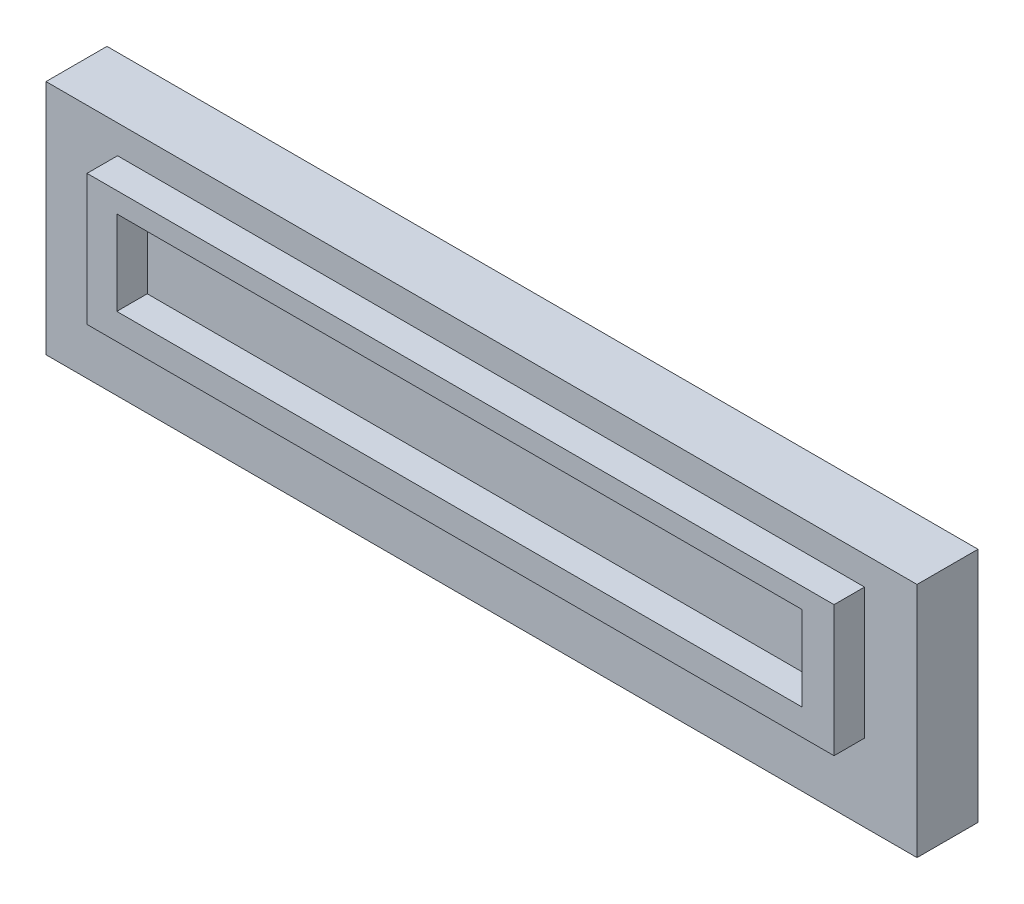
ISO-10303-21;
HEADER;
FILE_DESCRIPTION(('STEP AP214'),'2;1');
FILE_NAME('part.step','',(''),(''),'','','');
FILE_SCHEMA(('AUTOMOTIVE_DESIGN { 1 0 10303 214 1 1 1 1 }'));
ENDSEC;
DATA;
#1=APPLICATION_CONTEXT('core data for automotive mechanical design processes');
#2=APPLICATION_PROTOCOL_DEFINITION('international standard','automotive_design',2000,#1);
#3=PRODUCT_CONTEXT('',#1,'mechanical');
#4=PRODUCT('Part','Part','',(#3));
#5=PRODUCT_RELATED_PRODUCT_CATEGORY('part','',(#4));
#6=PRODUCT_DEFINITION_FORMATION('','',#4);
#7=PRODUCT_DEFINITION_CONTEXT('part definition',#1,'design');
#8=PRODUCT_DEFINITION('design','',#6,#7);
#9=PRODUCT_DEFINITION_SHAPE('','',#8);
#10=(LENGTH_UNIT() NAMED_UNIT(*) SI_UNIT(.MILLI.,.METRE.));
#11=(NAMED_UNIT(*) PLANE_ANGLE_UNIT() SI_UNIT($,.RADIAN.));
#12=(NAMED_UNIT(*) SI_UNIT($,.STERADIAN.) SOLID_ANGLE_UNIT());
#13=UNCERTAINTY_MEASURE_WITH_UNIT(LENGTH_MEASURE(1.E-05),#10,'distance_accuracy_value','');
#14=(GEOMETRIC_REPRESENTATION_CONTEXT(3) GLOBAL_UNCERTAINTY_ASSIGNED_CONTEXT((#13)) GLOBAL_UNIT_ASSIGNED_CONTEXT((#10,
#11,#12)) REPRESENTATION_CONTEXT('',''));
#15=CARTESIAN_POINT('',(0.,0.,0.));
#16=DIRECTION('',(0.,0.,1.));
#17=DIRECTION('',(1.,0.,0.));
#18=AXIS2_PLACEMENT_3D('',#15,#16,#17);
#19=CARTESIAN_POINT('',(0.,0.,10.));
#20=DIRECTION('',(0.,0.,-1.));
#21=DIRECTION('',(-1.,0.,0.));
#22=AXIS2_PLACEMENT_3D('',#19,#20,#21);
#23=PLANE('',#22);
#24=DIRECTION('',(0.,1.,0.));
#25=VECTOR('',#24,1.);
#26=CARTESIAN_POINT('',(57.347833866831,20.432312066326,10.));
#27=LINE('',#26,#25);
#28=CARTESIAN_POINT('',(57.347833866831,-18.3719108495537,10.));
#29=VERTEX_POINT('',#28);
#30=CARTESIAN_POINT('',(57.347833866831,20.432312066326,10.));
#31=VERTEX_POINT('',#30);
#32=EDGE_CURVE('E192',#29,#31,#27,.T.);
#33=ORIENTED_EDGE('',*,*,#32,.T.);
#34=DIRECTION('',(-1.,0.,0.));
#35=VECTOR('',#34,1.);
#36=CARTESIAN_POINT('',(57.347833866831,20.432312066326,10.));
#37=LINE('',#36,#35);
#38=CARTESIAN_POINT('',(-85.5066504960535,20.432312066326,10.));
#39=VERTEX_POINT('',#38);
#40=EDGE_CURVE('E195',#31,#39,#37,.T.);
#41=ORIENTED_EDGE('',*,*,#40,.T.);
#42=DIRECTION('',(0.,-1.,0.));
#43=VECTOR('',#42,1.);
#44=CARTESIAN_POINT('',(-85.5066504960535,20.432312066326,10.));
#45=LINE('',#44,#43);
#46=CARTESIAN_POINT('',(-85.5066504960535,-18.3719108495537,10.));
#47=VERTEX_POINT('',#46);
#48=EDGE_CURVE('E198',#39,#47,#45,.T.);
#49=ORIENTED_EDGE('',*,*,#48,.T.);
#50=DIRECTION('',(1.,0.,0.));
#51=VECTOR('',#50,1.);
#52=CARTESIAN_POINT('',(57.347833866831,-18.3719108495537,10.));
#53=LINE('',#52,#51);
#54=EDGE_CURVE('E200',#47,#29,#53,.T.);
#55=ORIENTED_EDGE('',*,*,#54,.T.);
#56=EDGE_LOOP('',(#33,#41,#49,#55));
#57=FACE_BOUND('',#56,.T.);
#58=DIRECTION('',(0.,1.,0.));
#59=VECTOR('',#58,1.);
#60=CARTESIAN_POINT('',(48.73819832638,15.7591735940845,10.));
#61=LINE('',#60,#59);
#62=CARTESIAN_POINT('',(48.73819832638,-5.7002572460057,10.));
#63=VERTEX_POINT('',#62);
#64=CARTESIAN_POINT('',(48.73819832638,15.7591735940845,10.));
#65=VERTEX_POINT('',#64);
#66=EDGE_CURVE('E140',#63,#65,#61,.T.);
#67=ORIENTED_EDGE('',*,*,#66,.F.);
#68=DIRECTION('',(1.,0.,0.));
#69=VECTOR('',#68,1.);
#70=CARTESIAN_POINT('',(48.73819832638,-5.7002572460057,10.));
#71=LINE('',#70,#69);
#72=CARTESIAN_POINT('',(-73.7756431970439,-5.70025724600572,10.));
#73=VERTEX_POINT('',#72);
#74=EDGE_CURVE('E168',#73,#63,#71,.T.);
#75=ORIENTED_EDGE('',*,*,#74,.F.);
#76=DIRECTION('',(0.,-1.,0.));
#77=VECTOR('',#76,1.);
#78=CARTESIAN_POINT('',(-73.7756431970439,15.7591735940845,10.));
#79=LINE('',#78,#77);
#80=CARTESIAN_POINT('',(-73.7756431970439,15.7591735940845,10.));
#81=VERTEX_POINT('',#80);
#82=EDGE_CURVE('E54',#81,#73,#79,.T.);
#83=ORIENTED_EDGE('',*,*,#82,.F.);
#84=DIRECTION('',(-1.,0.,0.));
#85=VECTOR('',#84,1.);
#86=CARTESIAN_POINT('',(48.73819832638,15.7591735940845,10.));
#87=LINE('',#86,#85);
#88=EDGE_CURVE('E49',#65,#81,#87,.T.);
#89=ORIENTED_EDGE('',*,*,#88,.F.);
#90=EDGE_LOOP('',(#67,#75,#83,#89));
#91=FACE_BOUND('',#90,.T.);
#92=ADVANCED_FACE('F34',(#57,#91),#23,.F.);
#93=CARTESIAN_POINT('',(57.347833866831,20.432312066326,10.));
#94=DIRECTION('',(-1.,0.,0.));
#95=DIRECTION('',(0.,0.,1.));
#96=AXIS2_PLACEMENT_3D('',#93,#94,#95);
#97=PLANE('',#96);
#98=DIRECTION('',(0.,1.,0.));
#99=VECTOR('',#98,1.);
#100=CARTESIAN_POINT('',(57.347833866831,20.432312066326,0.));
#101=LINE('',#100,#99);
#102=CARTESIAN_POINT('',(57.347833866831,-18.3719108495537,0.));
#103=VERTEX_POINT('',#102);
#104=CARTESIAN_POINT('',(57.347833866831,20.432312066326,0.));
#105=VERTEX_POINT('',#104);
#106=EDGE_CURVE('E191',#103,#105,#101,.T.);
#107=ORIENTED_EDGE('',*,*,#106,.T.);
#108=DIRECTION('',(0.,0.,-1.));
#109=VECTOR('',#108,1.);
#110=CARTESIAN_POINT('',(57.347833866831,20.432312066326,10.));
#111=LINE('',#110,#109);
#112=EDGE_CURVE('E11',#31,#105,#111,.T.);
#113=ORIENTED_EDGE('',*,*,#112,.F.);
#114=ORIENTED_EDGE('',*,*,#32,.F.);
#115=DIRECTION('',(0.,0.,-1.));
#116=VECTOR('',#115,1.);
#117=CARTESIAN_POINT('',(57.347833866831,-18.3719108495537,10.));
#118=LINE('',#117,#116);
#119=EDGE_CURVE('E202',#29,#103,#118,.T.);
#120=ORIENTED_EDGE('',*,*,#119,.T.);
#121=EDGE_LOOP('',(#107,#113,#114,#120));
#122=FACE_BOUND('',#121,.T.);
#123=ADVANCED_FACE('F36',(#122),#97,.F.);
#124=CARTESIAN_POINT('',(57.347833866831,20.432312066326,10.));
#125=DIRECTION('',(0.,-1.,0.));
#126=DIRECTION('',(0.,0.,-1.));
#127=AXIS2_PLACEMENT_3D('',#124,#125,#126);
#128=PLANE('',#127);
#129=DIRECTION('',(-1.,0.,0.));
#130=VECTOR('',#129,1.);
#131=CARTESIAN_POINT('',(57.347833866831,20.432312066326,0.));
#132=LINE('',#131,#130);
#133=CARTESIAN_POINT('',(-85.5066504960535,20.432312066326,0.));
#134=VERTEX_POINT('',#133);
#135=EDGE_CURVE('E205',#105,#134,#132,.T.);
#136=ORIENTED_EDGE('',*,*,#135,.T.);
#137=DIRECTION('',(0.,0.,-1.));
#138=VECTOR('',#137,1.);
#139=CARTESIAN_POINT('',(-85.5066504960535,20.432312066326,10.));
#140=LINE('',#139,#138);
#141=EDGE_CURVE('E42',#39,#134,#140,.T.);
#142=ORIENTED_EDGE('',*,*,#141,.F.);
#143=ORIENTED_EDGE('',*,*,#40,.F.);
#144=ORIENTED_EDGE('',*,*,#112,.T.);
#145=EDGE_LOOP('',(#136,#142,#143,#144));
#146=FACE_BOUND('',#145,.T.);
#147=ADVANCED_FACE('F234',(#146),#128,.F.);
#148=CARTESIAN_POINT('',(-85.5066504960535,20.432312066326,10.));
#149=DIRECTION('',(1.,0.,0.));
#150=DIRECTION('',(0.,0.,-1.));
#151=AXIS2_PLACEMENT_3D('',#148,#149,#150);
#152=PLANE('',#151);
#153=DIRECTION('',(0.,-1.,0.));
#154=VECTOR('',#153,1.);
#155=CARTESIAN_POINT('',(-85.5066504960535,20.432312066326,0.));
#156=LINE('',#155,#154);
#157=CARTESIAN_POINT('',(-85.5066504960535,-18.3719108495537,0.));
#158=VERTEX_POINT('',#157);
#159=EDGE_CURVE('E207',#134,#158,#156,.T.);
#160=ORIENTED_EDGE('',*,*,#159,.T.);
#161=DIRECTION('',(0.,0.,-1.));
#162=VECTOR('',#161,1.);
#163=CARTESIAN_POINT('',(-85.5066504960535,-18.3719108495537,10.));
#164=LINE('',#163,#162);
#165=EDGE_CURVE('E212',#47,#158,#164,.T.);
#166=ORIENTED_EDGE('',*,*,#165,.F.);
#167=ORIENTED_EDGE('',*,*,#48,.F.);
#168=ORIENTED_EDGE('',*,*,#141,.T.);
#169=EDGE_LOOP('',(#160,#166,#167,#168));
#170=FACE_BOUND('',#169,.T.);
#171=ADVANCED_FACE('F219',(#170),#152,.F.);
#172=CARTESIAN_POINT('',(57.347833866831,-18.3719108495537,10.));
#173=DIRECTION('',(0.,1.,0.));
#174=DIRECTION('',(0.,0.,1.));
#175=AXIS2_PLACEMENT_3D('',#172,#173,#174);
#176=PLANE('',#175);
#177=DIRECTION('',(1.,0.,0.));
#178=VECTOR('',#177,1.);
#179=CARTESIAN_POINT('',(57.347833866831,-18.3719108495537,0.));
#180=LINE('',#179,#178);
#181=EDGE_CURVE('E196',#158,#103,#180,.T.);
#182=ORIENTED_EDGE('',*,*,#181,.T.);
#183=ORIENTED_EDGE('',*,*,#119,.F.);
#184=ORIENTED_EDGE('',*,*,#54,.F.);
#185=ORIENTED_EDGE('',*,*,#165,.T.);
#186=EDGE_LOOP('',(#182,#183,#184,#185));
#187=FACE_BOUND('',#186,.T.);
#188=ADVANCED_FACE('F228',(#187),#176,.F.);
#189=CARTESIAN_POINT('',(0.,0.,0.));
#190=DIRECTION('',(0.,0.,-1.));
#191=DIRECTION('',(-1.,0.,0.));
#192=AXIS2_PLACEMENT_3D('',#189,#190,#191);
#193=PLANE('',#192);
#194=ORIENTED_EDGE('',*,*,#106,.F.);
#195=ORIENTED_EDGE('',*,*,#181,.F.);
#196=ORIENTED_EDGE('',*,*,#159,.F.);
#197=ORIENTED_EDGE('',*,*,#135,.F.);
#198=EDGE_LOOP('',(#194,#195,#196,#197));
#199=FACE_BOUND('',#198,.T.);
#200=ADVANCED_FACE('F225',(#199),#193,.T.);
#201=CARTESIAN_POINT('',(0.,0.,15.));
#202=DIRECTION('',(0.,0.,-1.));
#203=DIRECTION('',(-1.,0.,0.));
#204=AXIS2_PLACEMENT_3D('',#201,#202,#203);
#205=PLANE('',#204);
#206=DIRECTION('',(0.,1.,0.));
#207=VECTOR('',#206,1.);
#208=CARTESIAN_POINT('',(48.73819832638,15.7591735940845,15.));
#209=LINE('',#208,#207);
#210=CARTESIAN_POINT('',(48.73819832638,-5.7002572460057,15.));
#211=VERTEX_POINT('',#210);
#212=CARTESIAN_POINT('',(48.73819832638,15.7591735940845,15.));
#213=VERTEX_POINT('',#212);
#214=EDGE_CURVE('E164',#211,#213,#209,.T.);
#215=ORIENTED_EDGE('',*,*,#214,.T.);
#216=DIRECTION('',(-1.,0.,0.));
#217=VECTOR('',#216,1.);
#218=CARTESIAN_POINT('',(48.73819832638,15.7591735940845,15.));
#219=LINE('',#218,#217);
#220=CARTESIAN_POINT('',(-73.7756431970439,15.7591735940845,15.));
#221=VERTEX_POINT('',#220);
#222=EDGE_CURVE('E167',#213,#221,#219,.T.);
#223=ORIENTED_EDGE('',*,*,#222,.T.);
#224=DIRECTION('',(0.,-1.,0.));
#225=VECTOR('',#224,1.);
#226=CARTESIAN_POINT('',(-73.7756431970439,15.7591735940845,15.));
#227=LINE('',#226,#225);
#228=CARTESIAN_POINT('',(-73.7756431970439,-5.70025724600572,15.));
#229=VERTEX_POINT('',#228);
#230=EDGE_CURVE('E170',#221,#229,#227,.T.);
#231=ORIENTED_EDGE('',*,*,#230,.T.);
#232=DIRECTION('',(1.,0.,0.));
#233=VECTOR('',#232,1.);
#234=CARTESIAN_POINT('',(48.73819832638,-5.7002572460057,15.));
#235=LINE('',#234,#233);
#236=EDGE_CURVE('E172',#229,#211,#235,.T.);
#237=ORIENTED_EDGE('',*,*,#236,.T.);
#238=EDGE_LOOP('',(#215,#223,#231,#237));
#239=FACE_BOUND('',#238,.T.);
#240=DIRECTION('',(0.,1.,0.));
#241=VECTOR('',#240,1.);
#242=CARTESIAN_POINT('',(43.4708834838125,12.4427161006159,15.));
#243=LINE('',#242,#241);
#244=CARTESIAN_POINT('',(43.4708834838125,-1.40837107798772,15.));
#245=VERTEX_POINT('',#244);
#246=CARTESIAN_POINT('',(43.4708834838125,12.4427161006159,15.));
#247=VERTEX_POINT('',#246);
#248=EDGE_CURVE('E122',#245,#247,#243,.T.);
#249=ORIENTED_EDGE('',*,*,#248,.F.);
#250=DIRECTION('',(1.,0.,0.));
#251=VECTOR('',#250,1.);
#252=CARTESIAN_POINT('',(43.4708834838125,-1.40837107798772,15.));
#253=LINE('',#252,#251);
#254=CARTESIAN_POINT('',(-68.8984998242962,-1.40837107798772,15.));
#255=VERTEX_POINT('',#254);
#256=EDGE_CURVE('E148',#255,#245,#253,.T.);
#257=ORIENTED_EDGE('',*,*,#256,.F.);
#258=DIRECTION('',(0.,-1.,0.));
#259=VECTOR('',#258,1.);
#260=CARTESIAN_POINT('',(-68.8984998242962,12.4427161006159,15.));
#261=LINE('',#260,#259);
#262=CARTESIAN_POINT('',(-68.8984998242962,12.4427161006159,15.));
#263=VERTEX_POINT('',#262);
#264=EDGE_CURVE('E146',#263,#255,#261,.T.);
#265=ORIENTED_EDGE('',*,*,#264,.F.);
#266=DIRECTION('',(-1.,0.,0.));
#267=VECTOR('',#266,1.);
#268=CARTESIAN_POINT('',(43.4708834838125,12.4427161006159,15.));
#269=LINE('',#268,#267);
#270=EDGE_CURVE('E132',#247,#263,#269,.T.);
#271=ORIENTED_EDGE('',*,*,#270,.F.);
#272=EDGE_LOOP('',(#249,#257,#265,#271));
#273=FACE_BOUND('',#272,.T.);
#274=ADVANCED_FACE('F144',(#239,#273),#205,.F.);
#275=CARTESIAN_POINT('',(48.73819832638,15.7591735940845,15.));
#276=DIRECTION('',(-1.,0.,0.));
#277=DIRECTION('',(0.,0.,1.));
#278=AXIS2_PLACEMENT_3D('',#275,#276,#277);
#279=PLANE('',#278);
#280=ORIENTED_EDGE('',*,*,#66,.T.);
#281=DIRECTION('',(0.,0.,-1.));
#282=VECTOR('',#281,1.);
#283=CARTESIAN_POINT('',(48.73819832638,15.7591735940845,15.));
#284=LINE('',#283,#282);
#285=EDGE_CURVE('E189',#213,#65,#284,.T.);
#286=ORIENTED_EDGE('',*,*,#285,.F.);
#287=ORIENTED_EDGE('',*,*,#214,.F.);
#288=DIRECTION('',(0.,0.,-1.));
#289=VECTOR('',#288,1.);
#290=CARTESIAN_POINT('',(48.73819832638,-5.7002572460057,15.));
#291=LINE('',#290,#289);
#292=EDGE_CURVE('E174',#211,#63,#291,.T.);
#293=ORIENTED_EDGE('',*,*,#292,.T.);
#294=EDGE_LOOP('',(#280,#286,#287,#293));
#295=FACE_BOUND('',#294,.T.);
#296=ADVANCED_FACE('F272',(#295),#279,.F.);
#297=CARTESIAN_POINT('',(48.73819832638,15.7591735940845,15.));
#298=DIRECTION('',(0.,-1.,0.));
#299=DIRECTION('',(0.,0.,-1.));
#300=AXIS2_PLACEMENT_3D('',#297,#298,#299);
#301=PLANE('',#300);
#302=ORIENTED_EDGE('',*,*,#88,.T.);
#303=DIRECTION('',(0.,0.,-1.));
#304=VECTOR('',#303,1.);
#305=CARTESIAN_POINT('',(-73.7756431970439,15.7591735940845,15.));
#306=LINE('',#305,#304);
#307=EDGE_CURVE('E186',#221,#81,#306,.T.);
#308=ORIENTED_EDGE('',*,*,#307,.F.);
#309=ORIENTED_EDGE('',*,*,#222,.F.);
#310=ORIENTED_EDGE('',*,*,#285,.T.);
#311=EDGE_LOOP('',(#302,#308,#309,#310));
#312=FACE_BOUND('',#311,.T.);
#313=ADVANCED_FACE('F280',(#312),#301,.F.);
#314=CARTESIAN_POINT('',(-73.7756431970439,15.7591735940845,15.));
#315=DIRECTION('',(1.,0.,0.));
#316=DIRECTION('',(0.,0.,-1.));
#317=AXIS2_PLACEMENT_3D('',#314,#315,#316);
#318=PLANE('',#317);
#319=ORIENTED_EDGE('',*,*,#82,.T.);
#320=DIRECTION('',(0.,0.,-1.));
#321=VECTOR('',#320,1.);
#322=CARTESIAN_POINT('',(-73.7756431970439,-5.70025724600572,15.));
#323=LINE('',#322,#321);
#324=EDGE_CURVE('E183',#229,#73,#323,.T.);
#325=ORIENTED_EDGE('',*,*,#324,.F.);
#326=ORIENTED_EDGE('',*,*,#230,.F.);
#327=ORIENTED_EDGE('',*,*,#307,.T.);
#328=EDGE_LOOP('',(#319,#325,#326,#327));
#329=FACE_BOUND('',#328,.T.);
#330=ADVANCED_FACE('F276',(#329),#318,.F.);
#331=CARTESIAN_POINT('',(48.73819832638,-5.7002572460057,15.));
#332=DIRECTION('',(0.,1.,0.));
#333=DIRECTION('',(-1.,0.,0.));
#334=AXIS2_PLACEMENT_3D('',#331,#332,#333);
#335=PLANE('',#334);
#336=ORIENTED_EDGE('',*,*,#74,.T.);
#337=ORIENTED_EDGE('',*,*,#292,.F.);
#338=ORIENTED_EDGE('',*,*,#236,.F.);
#339=ORIENTED_EDGE('',*,*,#324,.T.);
#340=EDGE_LOOP('',(#336,#337,#338,#339));
#341=FACE_BOUND('',#340,.T.);
#342=ADVANCED_FACE('F269',(#341),#335,.F.);
#343=CARTESIAN_POINT('',(43.4708834838125,12.4427161006159,15.));
#344=DIRECTION('',(-1.,0.,0.));
#345=DIRECTION('',(0.,0.,1.));
#346=AXIS2_PLACEMENT_3D('',#343,#344,#345);
#347=PLANE('',#346);
#348=DIRECTION('',(0.,1.,0.));
#349=VECTOR('',#348,1.);
#350=CARTESIAN_POINT('',(43.4708834838125,12.4427161006159,10.));
#351=LINE('',#350,#349);
#352=CARTESIAN_POINT('',(43.4708834838125,-1.40837107798772,10.));
#353=VERTEX_POINT('',#352);
#354=CARTESIAN_POINT('',(43.4708834838125,12.4427161006159,10.));
#355=VERTEX_POINT('',#354);
#356=EDGE_CURVE('E152',#353,#355,#351,.T.);
#357=ORIENTED_EDGE('',*,*,#356,.F.);
#358=DIRECTION('',(0.,0.,-1.));
#359=VECTOR('',#358,1.);
#360=CARTESIAN_POINT('',(43.4708834838125,-1.40837107798772,15.));
#361=LINE('',#360,#359);
#362=EDGE_CURVE('E128',#245,#353,#361,.T.);
#363=ORIENTED_EDGE('',*,*,#362,.F.);
#364=ORIENTED_EDGE('',*,*,#248,.T.);
#365=DIRECTION('',(0.,0.,-1.));
#366=VECTOR('',#365,1.);
#367=CARTESIAN_POINT('',(43.4708834838125,12.4427161006159,15.));
#368=LINE('',#367,#366);
#369=EDGE_CURVE('E126',#247,#355,#368,.T.);
#370=ORIENTED_EDGE('',*,*,#369,.T.);
#371=EDGE_LOOP('',(#357,#363,#364,#370));
#372=FACE_BOUND('',#371,.T.);
#373=ADVANCED_FACE('F125',(#372),#347,.T.);
#374=CARTESIAN_POINT('',(43.4708834838125,12.4427161006159,15.));
#375=DIRECTION('',(0.,-1.,0.));
#376=DIRECTION('',(0.,0.,-1.));
#377=AXIS2_PLACEMENT_3D('',#374,#375,#376);
#378=PLANE('',#377);
#379=DIRECTION('',(-1.,0.,0.));
#380=VECTOR('',#379,1.);
#381=CARTESIAN_POINT('',(43.4708834838125,12.4427161006159,10.));
#382=LINE('',#381,#380);
#383=CARTESIAN_POINT('',(-68.8984998242962,12.4427161006159,10.));
#384=VERTEX_POINT('',#383);
#385=EDGE_CURVE('E139',#355,#384,#382,.T.);
#386=ORIENTED_EDGE('',*,*,#385,.F.);
#387=ORIENTED_EDGE('',*,*,#369,.F.);
#388=ORIENTED_EDGE('',*,*,#270,.T.);
#389=DIRECTION('',(0.,0.,-1.));
#390=VECTOR('',#389,1.);
#391=CARTESIAN_POINT('',(-68.8984998242962,12.4427161006159,15.));
#392=LINE('',#391,#390);
#393=EDGE_CURVE('E141',#263,#384,#392,.T.);
#394=ORIENTED_EDGE('',*,*,#393,.T.);
#395=EDGE_LOOP('',(#386,#387,#388,#394));
#396=FACE_BOUND('',#395,.T.);
#397=ADVANCED_FACE('F136',(#396),#378,.T.);
#398=CARTESIAN_POINT('',(-68.8984998242962,12.4427161006159,15.));
#399=DIRECTION('',(1.,0.,0.));
#400=DIRECTION('',(0.,0.,-1.));
#401=AXIS2_PLACEMENT_3D('',#398,#399,#400);
#402=PLANE('',#401);
#403=DIRECTION('',(0.,-1.,0.));
#404=VECTOR('',#403,1.);
#405=CARTESIAN_POINT('',(-68.8984998242962,12.4427161006159,10.));
#406=LINE('',#405,#404);
#407=CARTESIAN_POINT('',(-68.8984998242962,-1.40837107798772,10.));
#408=VERTEX_POINT('',#407);
#409=EDGE_CURVE('E155',#384,#408,#406,.T.);
#410=ORIENTED_EDGE('',*,*,#409,.F.);
#411=ORIENTED_EDGE('',*,*,#393,.F.);
#412=ORIENTED_EDGE('',*,*,#264,.T.);
#413=DIRECTION('',(0.,0.,-1.));
#414=VECTOR('',#413,1.);
#415=CARTESIAN_POINT('',(-68.8984998242962,-1.40837107798772,15.));
#416=LINE('',#415,#414);
#417=EDGE_CURVE('E161',#255,#408,#416,.T.);
#418=ORIENTED_EDGE('',*,*,#417,.T.);
#419=EDGE_LOOP('',(#410,#411,#412,#418));
#420=FACE_BOUND('',#419,.T.);
#421=ADVANCED_FACE('F254',(#420),#402,.T.);
#422=CARTESIAN_POINT('',(43.4708834838125,-1.40837107798772,15.));
#423=DIRECTION('',(0.,1.,0.));
#424=DIRECTION('',(0.,0.,1.));
#425=AXIS2_PLACEMENT_3D('',#422,#423,#424);
#426=PLANE('',#425);
#427=DIRECTION('',(1.,0.,0.));
#428=VECTOR('',#427,1.);
#429=CARTESIAN_POINT('',(43.4708834838125,-1.40837107798772,10.));
#430=LINE('',#429,#428);
#431=EDGE_CURVE('E133',#408,#353,#430,.T.);
#432=ORIENTED_EDGE('',*,*,#431,.F.);
#433=ORIENTED_EDGE('',*,*,#417,.F.);
#434=ORIENTED_EDGE('',*,*,#256,.T.);
#435=ORIENTED_EDGE('',*,*,#362,.T.);
#436=EDGE_LOOP('',(#432,#433,#434,#435));
#437=FACE_BOUND('',#436,.T.);
#438=ADVANCED_FACE('F249',(#437),#426,.T.);
#439=ORIENTED_EDGE('',*,*,#431,.T.);
#440=ORIENTED_EDGE('',*,*,#356,.T.);
#441=ORIENTED_EDGE('',*,*,#385,.T.);
#442=ORIENTED_EDGE('',*,*,#409,.T.);
#443=EDGE_LOOP('',(#439,#440,#441,#442));
#444=FACE_BOUND('',#443,.T.);
#445=ADVANCED_FACE('F243',(#444),#23,.F.);
#446=CLOSED_SHELL('',(#92,#123,#147,#171,#188,#200,#274,#296,#313,#330,#342,#373,#397,#421,#438,#445));
#447=MANIFOLD_SOLID_BREP('B2',#446);
#448=ADVANCED_BREP_SHAPE_REPRESENTATION('',(#18,#447),#14);
#449=SHAPE_DEFINITION_REPRESENTATION(#9,#448);
ENDSEC;
END-ISO-10303-21;
